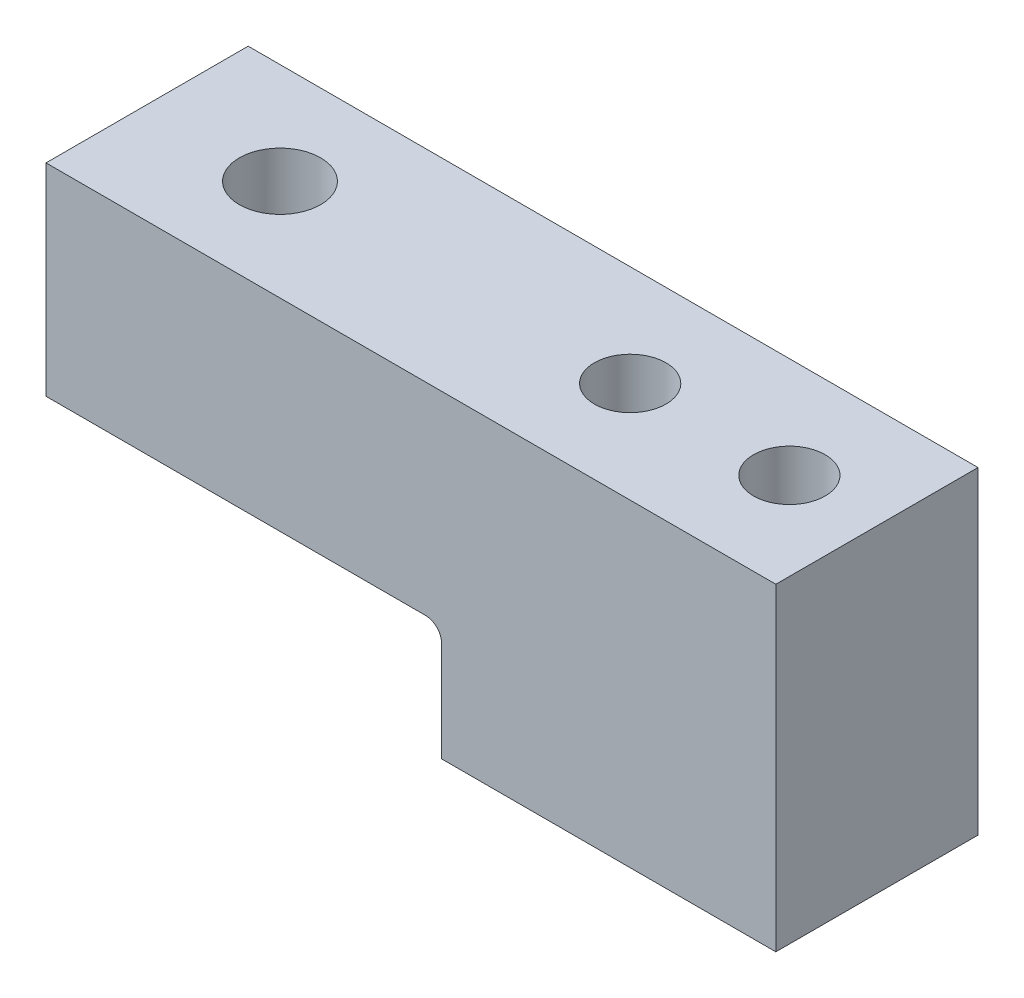
ISO-10303-21;
HEADER;
FILE_DESCRIPTION(('STEP AP214'),'2;1');
FILE_NAME('part.step','',(''),(''),'','','');
FILE_SCHEMA(('AUTOMOTIVE_DESIGN { 1 0 10303 214 1 1 1 1 }'));
ENDSEC;
DATA;
#1=APPLICATION_CONTEXT('core data for automotive mechanical design processes');
#2=APPLICATION_PROTOCOL_DEFINITION('international standard','automotive_design',2000,#1);
#3=PRODUCT_CONTEXT('',#1,'mechanical');
#4=PRODUCT('Part','Part','',(#3));
#5=PRODUCT_RELATED_PRODUCT_CATEGORY('part','',(#4));
#6=PRODUCT_DEFINITION_FORMATION('','',#4);
#7=PRODUCT_DEFINITION_CONTEXT('part definition',#1,'design');
#8=PRODUCT_DEFINITION('design','',#6,#7);
#9=PRODUCT_DEFINITION_SHAPE('','',#8);
#10=(LENGTH_UNIT() NAMED_UNIT(*) SI_UNIT(.MILLI.,.METRE.));
#11=(NAMED_UNIT(*) PLANE_ANGLE_UNIT() SI_UNIT($,.RADIAN.));
#12=(NAMED_UNIT(*) SI_UNIT($,.STERADIAN.) SOLID_ANGLE_UNIT());
#13=UNCERTAINTY_MEASURE_WITH_UNIT(LENGTH_MEASURE(1.E-05),#10,'distance_accuracy_value','');
#14=(GEOMETRIC_REPRESENTATION_CONTEXT(3) GLOBAL_UNCERTAINTY_ASSIGNED_CONTEXT((#13)) GLOBAL_UNIT_ASSIGNED_CONTEXT((#10,
#11,#12)) REPRESENTATION_CONTEXT('',''));
#15=CARTESIAN_POINT('',(0.,0.,0.));
#16=DIRECTION('',(0.,0.,1.));
#17=DIRECTION('',(1.,0.,0.));
#18=AXIS2_PLACEMENT_3D('',#15,#16,#17);
#19=CARTESIAN_POINT('',(0.,6.29999999999999,12.7));
#20=DIRECTION('',(1.,0.,0.));
#21=DIRECTION('',(0.,1.,0.));
#22=AXIS2_PLACEMENT_3D('',#19,#20,#21);
#23=PLANE('',#22);
#24=DIRECTION('',(0.,-1.,0.));
#25=VECTOR('',#24,1.);
#26=CARTESIAN_POINT('',(0.,6.29999999999999,0.));
#27=LINE('',#26,#25);
#28=CARTESIAN_POINT('',(0.,6.29999999999999,0.));
#29=VERTEX_POINT('',#28);
#30=CARTESIAN_POINT('',(0.,0.,0.));
#31=VERTEX_POINT('',#30);
#32=EDGE_CURVE('E144',#29,#31,#27,.T.);
#33=ORIENTED_EDGE('',*,*,#32,.T.);
#34=DIRECTION('',(0.,0.,-1.));
#35=VECTOR('',#34,1.);
#36=CARTESIAN_POINT('',(0.,0.,12.7));
#37=LINE('',#36,#35);
#38=CARTESIAN_POINT('',(0.,0.,12.7));
#39=VERTEX_POINT('',#38);
#40=EDGE_CURVE('E11',#39,#31,#37,.T.);
#41=ORIENTED_EDGE('',*,*,#40,.F.);
#42=DIRECTION('',(0.,-1.,0.));
#43=VECTOR('',#42,1.);
#44=CARTESIAN_POINT('',(0.,6.29999999999999,12.7));
#45=LINE('',#44,#43);
#46=CARTESIAN_POINT('',(0.,6.29999999999999,12.7));
#47=VERTEX_POINT('',#46);
#48=EDGE_CURVE('E164',#47,#39,#45,.T.);
#49=ORIENTED_EDGE('',*,*,#48,.F.);
#50=DIRECTION('',(0.,0.,-1.));
#51=VECTOR('',#50,1.);
#52=CARTESIAN_POINT('',(0.,6.29999999999999,12.7));
#53=LINE('',#52,#51);
#54=EDGE_CURVE('E140',#47,#29,#53,.T.);
#55=ORIENTED_EDGE('',*,*,#54,.T.);
#56=EDGE_LOOP('',(#33,#41,#49,#55));
#57=FACE_BOUND('',#56,.T.);
#58=ADVANCED_FACE('F47',(#57),#23,.F.);
#59=CARTESIAN_POINT('',(0.,0.,12.7));
#60=DIRECTION('',(0.,1.,0.));
#61=DIRECTION('',(0.,0.,1.));
#62=AXIS2_PLACEMENT_3D('',#59,#60,#61);
#63=PLANE('',#62);
#64=CARTESIAN_POINT('',(5.5,0.,6.35));
#65=DIRECTION('',(0.,1.,0.));
#66=DIRECTION('',(0.,0.,1.));
#67=AXIS2_PLACEMENT_3D('',#64,#65,#66);
#68=CIRCLE('',#67,2.25);
#69=CARTESIAN_POINT('',(5.5,0.,8.6));
#70=VERTEX_POINT('',#69);
#71=EDGE_CURVE('E207',#70,#70,#68,.T.);
#72=ORIENTED_EDGE('',*,*,#71,.T.);
#73=EDGE_LOOP('',(#72));
#74=FACE_BOUND('',#73,.T.);
#75=CARTESIAN_POINT('',(15.5,0.,6.35));
#76=DIRECTION('',(0.,1.,0.));
#77=DIRECTION('',(0.,0.,1.));
#78=AXIS2_PLACEMENT_3D('',#75,#76,#77);
#79=CIRCLE('',#78,2.25);
#80=CARTESIAN_POINT('',(15.5,0.,8.6));
#81=VERTEX_POINT('',#80);
#82=EDGE_CURVE('E149',#81,#81,#79,.T.);
#83=ORIENTED_EDGE('',*,*,#82,.T.);
#84=EDGE_LOOP('',(#83));
#85=FACE_BOUND('',#84,.T.);
#86=DIRECTION('',(1.,0.,0.));
#87=VECTOR('',#86,1.);
#88=CARTESIAN_POINT('',(0.,0.,0.));
#89=LINE('',#88,#87);
#90=CARTESIAN_POINT('',(21.,0.,0.));
#91=VERTEX_POINT('',#90);
#92=EDGE_CURVE('E148',#31,#91,#89,.T.);
#93=ORIENTED_EDGE('',*,*,#92,.T.);
#94=DIRECTION('',(0.,0.,-1.));
#95=VECTOR('',#94,1.);
#96=CARTESIAN_POINT('',(21.,0.,12.7));
#97=LINE('',#96,#95);
#98=CARTESIAN_POINT('',(21.,0.,12.7));
#99=VERTEX_POINT('',#98);
#100=EDGE_CURVE('E56',#99,#91,#97,.T.);
#101=ORIENTED_EDGE('',*,*,#100,.F.);
#102=DIRECTION('',(1.,0.,0.));
#103=VECTOR('',#102,1.);
#104=CARTESIAN_POINT('',(0.,0.,12.7));
#105=LINE('',#104,#103);
#106=EDGE_CURVE('E104',#39,#99,#105,.T.);
#107=ORIENTED_EDGE('',*,*,#106,.F.);
#108=ORIENTED_EDGE('',*,*,#40,.T.);
#109=EDGE_LOOP('',(#93,#101,#107,#108));
#110=FACE_BOUND('',#109,.T.);
#111=ADVANCED_FACE('F251',(#74,#85,#110),#63,.F.);
#112=CARTESIAN_POINT('',(21.,0.,12.7));
#113=DIRECTION('',(-1.,0.,0.));
#114=DIRECTION('',(0.,0.,1.));
#115=AXIS2_PLACEMENT_3D('',#112,#113,#114);
#116=PLANE('',#115);
#117=DIRECTION('',(0.,1.,0.));
#118=VECTOR('',#117,1.);
#119=CARTESIAN_POINT('',(21.,0.,0.));
#120=LINE('',#119,#118);
#121=CARTESIAN_POINT('',(21.,20.,0.));
#122=VERTEX_POINT('',#121);
#123=EDGE_CURVE('E152',#91,#122,#120,.T.);
#124=ORIENTED_EDGE('',*,*,#123,.T.);
#125=DIRECTION('',(0.,0.,-1.));
#126=VECTOR('',#125,1.);
#127=CARTESIAN_POINT('',(21.,20.,12.7));
#128=LINE('',#127,#126);
#129=CARTESIAN_POINT('',(21.,20.,12.7));
#130=VERTEX_POINT('',#129);
#131=EDGE_CURVE('E171',#130,#122,#128,.T.);
#132=ORIENTED_EDGE('',*,*,#131,.F.);
#133=DIRECTION('',(0.,1.,0.));
#134=VECTOR('',#133,1.);
#135=CARTESIAN_POINT('',(21.,0.,12.7));
#136=LINE('',#135,#134);
#137=EDGE_CURVE('E183',#99,#130,#136,.T.);
#138=ORIENTED_EDGE('',*,*,#137,.F.);
#139=ORIENTED_EDGE('',*,*,#100,.T.);
#140=EDGE_LOOP('',(#124,#132,#138,#139));
#141=FACE_BOUND('',#140,.T.);
#142=ADVANCED_FACE('F181',(#141),#116,.F.);
#143=CARTESIAN_POINT('',(21.,20.,12.7));
#144=DIRECTION('',(0.,-1.,0.));
#145=DIRECTION('',(1.,0.,0.));
#146=AXIS2_PLACEMENT_3D('',#143,#144,#145);
#147=PLANE('',#146);
#148=CARTESIAN_POINT('',(-16.5,20.,6.35));
#149=DIRECTION('',(0.,1.,0.));
#150=DIRECTION('',(0.,0.,1.));
#151=AXIS2_PLACEMENT_3D('',#148,#149,#150);
#152=CIRCLE('',#151,2.5527);
#153=CARTESIAN_POINT('',(-16.5,20.,8.9027));
#154=VERTEX_POINT('',#153);
#155=EDGE_CURVE('E219',#154,#154,#152,.T.);
#156=ORIENTED_EDGE('',*,*,#155,.F.);
#157=EDGE_LOOP('',(#156));
#158=FACE_BOUND('',#157,.T.);
#159=CARTESIAN_POINT('',(5.5,20.,6.35));
#160=DIRECTION('',(0.,1.,0.));
#161=DIRECTION('',(0.,0.,1.));
#162=AXIS2_PLACEMENT_3D('',#159,#160,#161);
#163=CIRCLE('',#162,2.24999999999999);
#164=CARTESIAN_POINT('',(5.5,20.,8.59999999999999));
#165=VERTEX_POINT('',#164);
#166=EDGE_CURVE('E211',#165,#165,#163,.T.);
#167=ORIENTED_EDGE('',*,*,#166,.F.);
#168=EDGE_LOOP('',(#167));
#169=FACE_BOUND('',#168,.T.);
#170=CARTESIAN_POINT('',(15.5,20.,6.35));
#171=DIRECTION('',(0.,1.,0.));
#172=DIRECTION('',(0.,0.,1.));
#173=AXIS2_PLACEMENT_3D('',#170,#171,#172);
#174=CIRCLE('',#173,2.24999999999999);
#175=CARTESIAN_POINT('',(15.5,20.,8.59999999999999));
#176=VERTEX_POINT('',#175);
#177=EDGE_CURVE('E203',#176,#176,#174,.T.);
#178=ORIENTED_EDGE('',*,*,#177,.F.);
#179=EDGE_LOOP('',(#178));
#180=FACE_BOUND('',#179,.T.);
#181=DIRECTION('',(-1.,0.,0.));
#182=VECTOR('',#181,1.);
#183=CARTESIAN_POINT('',(21.,20.,0.));
#184=LINE('',#183,#182);
#185=CARTESIAN_POINT('',(-24.85,20.,0.));
#186=VERTEX_POINT('',#185);
#187=EDGE_CURVE('E155',#122,#186,#184,.T.);
#188=ORIENTED_EDGE('',*,*,#187,.T.);
#189=DIRECTION('',(0.,0.,-1.));
#190=VECTOR('',#189,1.);
#191=CARTESIAN_POINT('',(-24.85,20.,12.7));
#192=LINE('',#191,#190);
#193=CARTESIAN_POINT('',(-24.85,20.,12.7));
#194=VERTEX_POINT('',#193);
#195=EDGE_CURVE('E131',#194,#186,#192,.T.);
#196=ORIENTED_EDGE('',*,*,#195,.F.);
#197=DIRECTION('',(-1.,0.,0.));
#198=VECTOR('',#197,1.);
#199=CARTESIAN_POINT('',(21.,20.,12.7));
#200=LINE('',#199,#198);
#201=EDGE_CURVE('E120',#130,#194,#200,.T.);
#202=ORIENTED_EDGE('',*,*,#201,.F.);
#203=ORIENTED_EDGE('',*,*,#131,.T.);
#204=EDGE_LOOP('',(#188,#196,#202,#203));
#205=FACE_BOUND('',#204,.T.);
#206=ADVANCED_FACE('F189',(#158,#169,#180,#205),#147,.F.);
#207=CARTESIAN_POINT('',(-24.85,20.,12.7));
#208=DIRECTION('',(1.,0.,0.));
#209=DIRECTION('',(0.,0.,-1.));
#210=AXIS2_PLACEMENT_3D('',#207,#208,#209);
#211=PLANE('',#210);
#212=DIRECTION('',(0.,-1.,0.));
#213=VECTOR('',#212,1.);
#214=CARTESIAN_POINT('',(-24.85,20.,0.));
#215=LINE('',#214,#213);
#216=CARTESIAN_POINT('',(-24.85,7.29999999999999,0.));
#217=VERTEX_POINT('',#216);
#218=EDGE_CURVE('E129',#186,#217,#215,.T.);
#219=ORIENTED_EDGE('',*,*,#218,.T.);
#220=DIRECTION('',(0.,0.,-1.));
#221=VECTOR('',#220,1.);
#222=CARTESIAN_POINT('',(-24.85,7.29999999999999,12.7));
#223=LINE('',#222,#221);
#224=CARTESIAN_POINT('',(-24.85,7.29999999999999,12.7));
#225=VERTEX_POINT('',#224);
#226=EDGE_CURVE('E126',#225,#217,#223,.T.);
#227=ORIENTED_EDGE('',*,*,#226,.F.);
#228=DIRECTION('',(0.,-1.,0.));
#229=VECTOR('',#228,1.);
#230=CARTESIAN_POINT('',(-24.85,20.,12.7));
#231=LINE('',#230,#229);
#232=EDGE_CURVE('E114',#194,#225,#231,.T.);
#233=ORIENTED_EDGE('',*,*,#232,.F.);
#234=ORIENTED_EDGE('',*,*,#195,.T.);
#235=EDGE_LOOP('',(#219,#227,#233,#234));
#236=FACE_BOUND('',#235,.T.);
#237=ADVANCED_FACE('F127',(#236),#211,.F.);
#238=CARTESIAN_POINT('',(-24.85,7.29999999999999,12.7));
#239=DIRECTION('',(0.,1.,0.));
#240=DIRECTION('',(-1.,0.,0.));
#241=AXIS2_PLACEMENT_3D('',#238,#239,#240);
#242=PLANE('',#241);
#243=CARTESIAN_POINT('',(-16.5,7.3,6.35));
#244=DIRECTION('',(0.,1.,0.));
#245=DIRECTION('',(-1.,0.,0.));
#246=AXIS2_PLACEMENT_3D('',#243,#244,#245);
#247=CIRCLE('',#246,2.5527);
#248=CARTESIAN_POINT('',(-19.0527,7.29999999999999,6.35));
#249=VERTEX_POINT('',#248);
#250=EDGE_CURVE('E215',#249,#249,#247,.T.);
#251=ORIENTED_EDGE('',*,*,#250,.T.);
#252=EDGE_LOOP('',(#251));
#253=FACE_BOUND('',#252,.T.);
#254=DIRECTION('',(1.,0.,0.));
#255=VECTOR('',#254,1.);
#256=CARTESIAN_POINT('',(-24.85,7.29999999999999,0.));
#257=LINE('',#256,#255);
#258=CARTESIAN_POINT('',(-1.00000000000001,7.3,0.));
#259=VERTEX_POINT('',#258);
#260=EDGE_CURVE('E90',#217,#259,#257,.T.);
#261=ORIENTED_EDGE('',*,*,#260,.T.);
#262=DIRECTION('',(0.,0.,-1.));
#263=VECTOR('',#262,1.);
#264=CARTESIAN_POINT('',(-1.00000000000001,7.3,12.7));
#265=LINE('',#264,#263);
#266=CARTESIAN_POINT('',(-1.00000000000001,7.3,12.7));
#267=VERTEX_POINT('',#266);
#268=EDGE_CURVE('E132',#267,#259,#265,.T.);
#269=ORIENTED_EDGE('',*,*,#268,.F.);
#270=DIRECTION('',(1.,0.,0.));
#271=VECTOR('',#270,1.);
#272=CARTESIAN_POINT('',(-24.85,7.29999999999999,12.7));
#273=LINE('',#272,#271);
#274=EDGE_CURVE('E118',#225,#267,#273,.T.);
#275=ORIENTED_EDGE('',*,*,#274,.F.);
#276=ORIENTED_EDGE('',*,*,#226,.T.);
#277=EDGE_LOOP('',(#261,#269,#275,#276));
#278=FACE_BOUND('',#277,.T.);
#279=ADVANCED_FACE('F134',(#253,#278),#242,.F.);
#280=CARTESIAN_POINT('',(-1.,6.3,12.7));
#281=DIRECTION('',(0.,0.,-1.));
#282=DIRECTION('',(-1.,0.,0.));
#283=AXIS2_PLACEMENT_3D('',#280,#281,#282);
#284=CYLINDRICAL_SURFACE('',#283,1.);
#285=CARTESIAN_POINT('',(-1.,6.3,0.));
#286=DIRECTION('',(0.,0.,-1.));
#287=DIRECTION('',(1.,0.,0.));
#288=AXIS2_PLACEMENT_3D('',#285,#286,#287);
#289=CIRCLE('',#288,1.);
#290=EDGE_CURVE('E96',#259,#29,#289,.T.);
#291=ORIENTED_EDGE('',*,*,#290,.T.);
#292=ORIENTED_EDGE('',*,*,#54,.F.);
#293=CARTESIAN_POINT('',(-1.,6.3,12.7));
#294=DIRECTION('',(0.,0.,-1.));
#295=DIRECTION('',(1.,0.,0.));
#296=AXIS2_PLACEMENT_3D('',#293,#294,#295);
#297=CIRCLE('',#296,1.);
#298=EDGE_CURVE('E64',#267,#47,#297,.T.);
#299=ORIENTED_EDGE('',*,*,#298,.F.);
#300=ORIENTED_EDGE('',*,*,#268,.T.);
#301=EDGE_LOOP('',(#291,#292,#299,#300));
#302=FACE_BOUND('',#301,.T.);
#303=ADVANCED_FACE('F259',(#302),#284,.F.);
#304=CARTESIAN_POINT('',(-1.,6.3,12.7));
#305=DIRECTION('',(0.,0.,1.));
#306=DIRECTION('',(1.,0.,0.));
#307=AXIS2_PLACEMENT_3D('',#304,#305,#306);
#308=PLANE('',#307);
#309=ORIENTED_EDGE('',*,*,#48,.T.);
#310=ORIENTED_EDGE('',*,*,#106,.T.);
#311=ORIENTED_EDGE('',*,*,#137,.T.);
#312=ORIENTED_EDGE('',*,*,#201,.T.);
#313=ORIENTED_EDGE('',*,*,#232,.T.);
#314=ORIENTED_EDGE('',*,*,#274,.T.);
#315=ORIENTED_EDGE('',*,*,#298,.T.);
#316=EDGE_LOOP('',(#309,#310,#311,#312,#313,#314,#315));
#317=FACE_BOUND('',#316,.T.);
#318=ADVANCED_FACE('F116',(#317),#308,.T.);
#319=CARTESIAN_POINT('',(-1.,6.3,0.));
#320=DIRECTION('',(0.,0.,1.));
#321=DIRECTION('',(1.,0.,0.));
#322=AXIS2_PLACEMENT_3D('',#319,#320,#321);
#323=PLANE('',#322);
#324=ORIENTED_EDGE('',*,*,#32,.F.);
#325=ORIENTED_EDGE('',*,*,#290,.F.);
#326=ORIENTED_EDGE('',*,*,#260,.F.);
#327=ORIENTED_EDGE('',*,*,#218,.F.);
#328=ORIENTED_EDGE('',*,*,#187,.F.);
#329=ORIENTED_EDGE('',*,*,#123,.F.);
#330=ORIENTED_EDGE('',*,*,#92,.F.);
#331=EDGE_LOOP('',(#324,#325,#326,#327,#328,#329,#330));
#332=FACE_BOUND('',#331,.T.);
#333=ADVANCED_FACE('F187',(#332),#323,.F.);
#334=CARTESIAN_POINT('',(15.5,20.,6.35));
#335=DIRECTION('',(0.,1.,0.));
#336=DIRECTION('',(0.,0.,1.));
#337=AXIS2_PLACEMENT_3D('',#334,#335,#336);
#338=CYLINDRICAL_SURFACE('',#337,2.24999999999999);
#339=ORIENTED_EDGE('',*,*,#82,.F.);
#340=EDGE_LOOP('',(#339));
#341=FACE_BOUND('',#340,.T.);
#342=ORIENTED_EDGE('',*,*,#177,.T.);
#343=EDGE_LOOP('',(#342));
#344=FACE_BOUND('',#343,.T.);
#345=ADVANCED_FACE('F236',(#341,#344),#338,.F.);
#346=CARTESIAN_POINT('',(5.5,20.,6.35));
#347=DIRECTION('',(0.,1.,0.));
#348=DIRECTION('',(0.,0.,1.));
#349=AXIS2_PLACEMENT_3D('',#346,#347,#348);
#350=CYLINDRICAL_SURFACE('',#349,2.24999999999999);
#351=ORIENTED_EDGE('',*,*,#71,.F.);
#352=EDGE_LOOP('',(#351));
#353=FACE_BOUND('',#352,.T.);
#354=ORIENTED_EDGE('',*,*,#166,.T.);
#355=EDGE_LOOP('',(#354));
#356=FACE_BOUND('',#355,.T.);
#357=ADVANCED_FACE('F238',(#353,#356),#350,.F.);
#358=CARTESIAN_POINT('',(-16.5,20.,6.35));
#359=DIRECTION('',(0.,1.,0.));
#360=DIRECTION('',(0.,0.,1.));
#361=AXIS2_PLACEMENT_3D('',#358,#359,#360);
#362=CYLINDRICAL_SURFACE('',#361,2.5527);
#363=ORIENTED_EDGE('',*,*,#155,.T.);
#364=EDGE_LOOP('',(#363));
#365=FACE_BOUND('',#364,.T.);
#366=ORIENTED_EDGE('',*,*,#250,.F.);
#367=EDGE_LOOP('',(#366));
#368=FACE_BOUND('',#367,.T.);
#369=ADVANCED_FACE('F226',(#365,#368),#362,.F.);
#370=CLOSED_SHELL('',(#58,#111,#142,#206,#237,#279,#303,#318,#333,#345,#357,#369));
#371=MANIFOLD_SOLID_BREP('B2',#370);
#372=ADVANCED_BREP_SHAPE_REPRESENTATION('',(#18,#371),#14);
#373=SHAPE_DEFINITION_REPRESENTATION(#9,#372);
ENDSEC;
END-ISO-10303-21;
